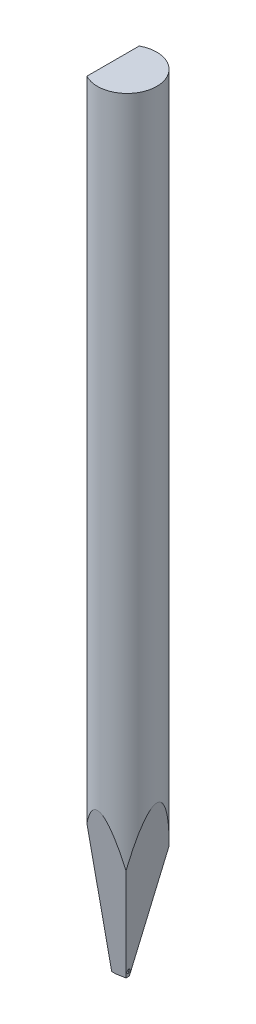
ISO-10303-21;
HEADER;
FILE_DESCRIPTION(('STEP AP214'),'2;1');
FILE_NAME('part.step','',(''),(''),'','','');
FILE_SCHEMA(('AUTOMOTIVE_DESIGN { 1 0 10303 214 1 1 1 1 }'));
ENDSEC;
DATA;
#1=APPLICATION_CONTEXT('core data for automotive mechanical design processes');
#2=APPLICATION_PROTOCOL_DEFINITION('international standard','automotive_design',2000,#1);
#3=PRODUCT_CONTEXT('',#1,'mechanical');
#4=PRODUCT('Part','Part','',(#3));
#5=PRODUCT_RELATED_PRODUCT_CATEGORY('part','',(#4));
#6=PRODUCT_DEFINITION_FORMATION('','',#4);
#7=PRODUCT_DEFINITION_CONTEXT('part definition',#1,'design');
#8=PRODUCT_DEFINITION('design','',#6,#7);
#9=PRODUCT_DEFINITION_SHAPE('','',#8);
#10=(LENGTH_UNIT() NAMED_UNIT(*) SI_UNIT(.MILLI.,.METRE.));
#11=(NAMED_UNIT(*) PLANE_ANGLE_UNIT() SI_UNIT($,.RADIAN.));
#12=(NAMED_UNIT(*) SI_UNIT($,.STERADIAN.) SOLID_ANGLE_UNIT());
#13=UNCERTAINTY_MEASURE_WITH_UNIT(LENGTH_MEASURE(1.E-05),#10,'distance_accuracy_value','');
#14=(GEOMETRIC_REPRESENTATION_CONTEXT(3) GLOBAL_UNCERTAINTY_ASSIGNED_CONTEXT((#13)) GLOBAL_UNIT_ASSIGNED_CONTEXT((#10,
#11,#12)) REPRESENTATION_CONTEXT('',''));
#15=CARTESIAN_POINT('',(0.,0.,0.));
#16=DIRECTION('',(0.,0.,1.));
#17=DIRECTION('',(1.,0.,0.));
#18=AXIS2_PLACEMENT_3D('',#15,#16,#17);
#19=CARTESIAN_POINT('',(-0.2794,0.,27.2760283406468));
#20=DIRECTION('',(-0.173648177666931,0.984807753012208,0.));
#21=DIRECTION('',(-0.984807753012208,-0.173648177666931,0.));
#22=AXIS2_PLACEMENT_3D('',#19,#20,#21);
#23=PLANE('',#22);
#24=DIRECTION('',(-0.984807753012208,-0.173648177666931,0.));
#25=VECTOR('',#24,1.);
#26=CARTESIAN_POINT('',(-0.2794,0.,0.0285749999999994));
#27=LINE('',#26,#25);
#28=CARTESIAN_POINT('',(-0.1143,0.0291115845149677,0.0285749999999997));
#29=VERTEX_POINT('',#28);
#30=CARTESIAN_POINT('',(-0.264607206717196,0.00260836857580255,0.028575));
#31=VERTEX_POINT('',#30);
#32=EDGE_CURVE('E178',#29,#31,#27,.T.);
#33=ORIENTED_EDGE('',*,*,#32,.F.);
#34=DIRECTION('',(0.,0.,1.));
#35=VECTOR('',#34,1.);
#36=CARTESIAN_POINT('',(-0.1143,0.0291115845149677,27.2760283406468));
#37=LINE('',#36,#35);
#38=CARTESIAN_POINT('',(-0.1143,0.0291115845149677,-0.0285749999999997));
#39=VERTEX_POINT('',#38);
#40=EDGE_CURVE('E223',#39,#29,#37,.T.);
#41=ORIENTED_EDGE('',*,*,#40,.F.);
#42=DIRECTION('',(-0.984807753012208,-0.173648177666931,0.));
#43=VECTOR('',#42,1.);
#44=CARTESIAN_POINT('',(-0.2794,0.,-0.0285749999999994));
#45=LINE('',#44,#43);
#46=CARTESIAN_POINT('',(-0.264607206717196,0.00260836857580255,-0.028575));
#47=VERTEX_POINT('',#46);
#48=EDGE_CURVE('E175',#39,#47,#45,.T.);
#49=ORIENTED_EDGE('',*,*,#48,.T.);
#50=CARTESIAN_POINT('',(-2.18806989639233,-0.33655,0.));
#51=DIRECTION('',(-0.173648177666931,0.984807753012208,0.));
#52=DIRECTION('',(-0.984807753012208,-0.173648177666931,0.));
#53=AXIS2_PLACEMENT_3D('',#50,#51,#52);
#54=ELLIPSE('',#53,1.96005512164276,0.34036);
#55=CARTESIAN_POINT('',(-0.26855815649043,0.00191170953135495,-0.0358970859696553));
#56=VERTEX_POINT('',#55);
#57=EDGE_CURVE('E76',#47,#56,#54,.T.);
#58=ORIENTED_EDGE('',*,*,#57,.T.);
#59=DIRECTION('',(0.984346441568213,0.173566836012845,-0.0306045161452665));
#60=VECTOR('',#59,1.);
#61=CARTESIAN_POINT('',(26.0304347628768,4.6391337266767,-0.853564443127717));
#62=LINE('',#61,#60);
#63=CARTESIAN_POINT('',(0.0142086463569767,0.0517711261220242,-0.0446886463569738));
#64=VERTEX_POINT('',#63);
#65=EDGE_CURVE('E213',#56,#64,#62,.T.);
#66=ORIENTED_EDGE('',*,*,#65,.T.);
#67=DIRECTION('',(0.,0.,-1.));
#68=VECTOR('',#67,1.);
#69=CARTESIAN_POINT('',(0.0142086463569737,0.0517711261220249,27.2760283406468));
#70=LINE('',#69,#68);
#71=CARTESIAN_POINT('',(0.0142086463569767,0.0517711261220242,0.0446886463569738));
#72=VERTEX_POINT('',#71);
#73=EDGE_CURVE('E181',#72,#64,#70,.T.);
#74=ORIENTED_EDGE('',*,*,#73,.F.);
#75=DIRECTION('',(-0.984346441568213,-0.173566836012845,-0.0306045161452665));
#76=VECTOR('',#75,1.);
#77=CARTESIAN_POINT('',(26.0304347628768,4.6391337266767,0.853564443127717));
#78=LINE('',#77,#76);
#79=CARTESIAN_POINT('',(-0.26855815649043,0.00191170953135495,0.0358970859696553));
#80=VERTEX_POINT('',#79);
#81=EDGE_CURVE('E191',#72,#80,#78,.T.);
#82=ORIENTED_EDGE('',*,*,#81,.T.);
#83=EDGE_CURVE('E216',#80,#31,#54,.T.);
#84=ORIENTED_EDGE('',*,*,#83,.T.);
#85=EDGE_LOOP('',(#33,#41,#49,#58,#66,#74,#82,#84));
#86=FACE_BOUND('',#85,.T.);
#87=ADVANCED_FACE('F46',(#86),#23,.F.);
#88=CARTESIAN_POINT('',(26.7532219491216,-0.33655,0.));
#89=DIRECTION('',(-1.,0.,0.));
#90=DIRECTION('',(0.,0.,1.));
#91=AXIS2_PLACEMENT_3D('',#88,#89,#90);
#92=CYLINDRICAL_SURFACE('',#91,0.34036);
#93=DIRECTION('',(-1.,0.,0.));
#94=VECTOR('',#93,1.);
#95=CARTESIAN_POINT('',(26.7532219491216,0.00191170953135473,0.0358970859696554));
#96=LINE('',#95,#94);
#97=CARTESIAN_POINT('',(-0.375919999999998,0.00191170953135473,0.0358970859696554));
#98=VERTEX_POINT('',#97);
#99=EDGE_CURVE('E185',#80,#98,#96,.T.);
#100=ORIENTED_EDGE('',*,*,#99,.T.);
#101=CARTESIAN_POINT('',(-0.37592,0.00191170953135473,-0.0358970859696554));
#102=CARTESIAN_POINT('',(-0.365756971335597,0.00317578781335809,-0.0239785113903732));
#103=CARTESIAN_POINT('',(-0.355599999999994,0.00380999999999997,-0.0119879732544419));
#104=CARTESIAN_POINT('',(-0.355599999999994,0.00380999999999995,0.0119879732544424));
#105=CARTESIAN_POINT('',(-0.365756971335597,0.00317578781335811,0.0239785113903729));
#106=CARTESIAN_POINT('',(-0.37592,0.00191170953135473,0.0358970859696553));
#107=(BOUNDED_CURVE() B_SPLINE_CURVE(3,(#101,#102,#103,#104,#105,#106),.UNSPECIFIED.,.F.,
.F.) B_SPLINE_CURVE_WITH_KNOTS((4,2,4),(1.46513182008187,1.5707963267949,1.67646083350792),
.UNSPECIFIED.) CURVE() GEOMETRIC_REPRESENTATION_ITEM() RATIONAL_B_SPLINE_CURVE((1.,1.,1.,1.,1.,1.)) REPRESENTATION_ITEM(''));
#108=CARTESIAN_POINT('',(-0.375919999999998,0.00191170953135473,-0.0358970859696554));
#109=VERTEX_POINT('',#108);
#110=EDGE_CURVE('E60',#98,#109,#107,.F.);
#111=ORIENTED_EDGE('',*,*,#110,.T.);
#112=DIRECTION('',(-1.,0.,0.));
#113=VECTOR('',#112,1.);
#114=CARTESIAN_POINT('',(26.7532219491216,0.00191170953135473,-0.0358970859696554));
#115=LINE('',#114,#113);
#116=EDGE_CURVE('E222',#109,#56,#115,.F.);
#117=ORIENTED_EDGE('',*,*,#116,.T.);
#118=ORIENTED_EDGE('',*,*,#57,.F.);
#119=DIRECTION('',(-1.,0.,0.));
#120=VECTOR('',#119,1.);
#121=CARTESIAN_POINT('',(26.7532219491216,0.00260836857580255,-0.028575));
#122=LINE('',#121,#120);
#123=CARTESIAN_POINT('',(-0.270298489816422,0.00260836857580467,-0.028575));
#124=VERTEX_POINT('',#123);
#125=EDGE_CURVE('E219',#47,#124,#122,.T.);
#126=ORIENTED_EDGE('',*,*,#125,.T.);
#127=CARTESIAN_POINT('',(-0.270298489816426,0.00260836857580259,0.028575));
#128=CARTESIAN_POINT('',(-0.278359100214701,0.00221626932534202,0.0332288492425529));
#129=CARTESIAN_POINT('',(-0.289281797844337,0.00224694405598525,0.0330338546009613));
#130=CARTESIAN_POINT('',(-0.307596392575123,0.003130563846706,0.0221747468136145));
#131=CARTESIAN_POINT('',(-0.314368855863126,0.00381431132404112,0.0112699230252015));
#132=CARTESIAN_POINT('',(-0.314294835670741,0.00380563943309772,-0.0115288461768703));
#133=CARTESIAN_POINT('',(-0.3074835861126,0.0031190469839627,-0.0223381582503309));
#134=CARTESIAN_POINT('',(-0.289156503578033,0.00224008059703033,-0.0330958620083312));
#135=CARTESIAN_POINT('',(-0.278322558634203,0.00221755981884593,-0.0332135322986704));
#136=CARTESIAN_POINT('',(-0.270298489816426,0.0026083685758026,-0.028575));
#137=(BOUNDED_CURVE() B_SPLINE_CURVE(3,(#127,#128,#129,#130,#131,#132,#133,#134,#135,#136),
.UNSPECIFIED.,.F.,.F.) B_SPLINE_CURVE_WITH_KNOTS((4,2,2,2,4),(0.,2.38139585135698E-05,
4.76279170271358E-05,7.14418755407019E-05,9.5255834054268E-05),
.UNSPECIFIED.) CURVE() GEOMETRIC_REPRESENTATION_ITEM() RATIONAL_B_SPLINE_CURVE((1.,1.,1.,1.,1.,
1.,1.,1.,1.,1.)) REPRESENTATION_ITEM(''));
#138=CARTESIAN_POINT('',(-0.270298489816422,0.0026083685758042,0.028575));
#139=VERTEX_POINT('',#138);
#140=EDGE_CURVE('E225',#124,#139,#137,.F.);
#141=ORIENTED_EDGE('',*,*,#140,.T.);
#142=DIRECTION('',(-1.,0.,0.));
#143=VECTOR('',#142,1.);
#144=CARTESIAN_POINT('',(26.7532219491216,0.00260836857580255,0.028575));
#145=LINE('',#144,#143);
#146=EDGE_CURVE('E226',#31,#139,#145,.T.);
#147=ORIENTED_EDGE('',*,*,#146,.F.);
#148=ORIENTED_EDGE('',*,*,#83,.F.);
#149=EDGE_LOOP('',(#100,#111,#117,#118,#126,#141,#147,#148));
#150=FACE_BOUND('',#149,.T.);
#151=ADVANCED_FACE('F239',(#150),#92,.F.);
#152=CARTESIAN_POINT('',(0.,21.0312,0.));
#153=DIRECTION('',(0.,-1.,0.));
#154=DIRECTION('',(0.,0.,-1.));
#155=AXIS2_PLACEMENT_3D('',#152,#153,#154);
#156=CYLINDRICAL_SURFACE('',#155,0.792479999999998);
#157=CARTESIAN_POINT('',(0.,-0.201670781505604,0.));
#158=DIRECTION('',(0.,-0.173648177666931,0.984807753012208));
#159=DIRECTION('',(0.,-0.984807753012208,-0.173648177666931));
#160=AXIS2_PLACEMENT_3D('',#157,#158,#159);
#161=ELLIPSE('',#160,4.56371043248163,0.792479999999998);
#162=CARTESIAN_POINT('',(0.544920706940428,3.06158878676079,0.575400706940426));
#163=VERTEX_POINT('',#162);
#164=CARTESIAN_POINT('',(-0.37592,3.75487126564512,0.69764511322018));
#165=VERTEX_POINT('',#164);
#166=EDGE_CURVE('E194',#163,#165,#161,.T.);
#167=ORIENTED_EDGE('',*,*,#166,.F.);
#168=CARTESIAN_POINT('',(0.,-0.0288101116436568,0.));
#169=DIRECTION('',(-0.984807753012208,0.173648177666931,0.));
#170=DIRECTION('',(-0.173648177666931,-0.984807753012208,0.));
#171=AXIS2_PLACEMENT_3D('',#168,#169,#170);
#172=ELLIPSE('',#171,4.56371043248164,0.792479999999998);
#173=CARTESIAN_POINT('',(0.544920706940428,3.06158878676079,-0.575400706940426));
#174=VERTEX_POINT('',#173);
#175=EDGE_CURVE('E184',#163,#174,#172,.T.);
#176=ORIENTED_EDGE('',*,*,#175,.T.);
#177=CARTESIAN_POINT('',(0.,-0.201670781505604,0.));
#178=DIRECTION('',(0.,-0.173648177666931,-0.984807753012208));
#179=DIRECTION('',(0.,-0.984807753012208,0.173648177666931));
#180=AXIS2_PLACEMENT_3D('',#177,#178,#179);
#181=ELLIPSE('',#180,4.56371043248163,0.792479999999998);
#182=CARTESIAN_POINT('',(-0.37592,3.75487126564511,-0.69764511322018));
#183=VERTEX_POINT('',#182);
#184=EDGE_CURVE('E197',#183,#174,#181,.T.);
#185=ORIENTED_EDGE('',*,*,#184,.F.);
#186=DIRECTION('',(0.,-1.,0.));
#187=VECTOR('',#186,1.);
#188=CARTESIAN_POINT('',(-0.37592,21.0312,-0.69764511322018));
#189=LINE('',#188,#187);
#190=CARTESIAN_POINT('',(-0.37592,21.0312,-0.69764511322018));
#191=VERTEX_POINT('',#190);
#192=EDGE_CURVE('E203',#191,#183,#189,.T.);
#193=ORIENTED_EDGE('',*,*,#192,.F.);
#194=CARTESIAN_POINT('',(0.,21.0312,0.));
#195=DIRECTION('',(0.,1.,0.));
#196=DIRECTION('',(0.,0.,1.));
#197=AXIS2_PLACEMENT_3D('',#194,#195,#196);
#198=CIRCLE('',#197,0.792479999999998);
#199=CARTESIAN_POINT('',(-0.37592,21.0312,0.69764511322018));
#200=VERTEX_POINT('',#199);
#201=EDGE_CURVE('E206',#200,#191,#198,.T.);
#202=ORIENTED_EDGE('',*,*,#201,.F.);
#203=DIRECTION('',(0.,-1.,0.));
#204=VECTOR('',#203,1.);
#205=CARTESIAN_POINT('',(-0.37592,21.0312,0.69764511322018));
#206=LINE('',#205,#204);
#207=EDGE_CURVE('E201',#165,#200,#206,.F.);
#208=ORIENTED_EDGE('',*,*,#207,.F.);
#209=EDGE_LOOP('',(#167,#176,#185,#193,#202,#208));
#210=FACE_BOUND('',#209,.T.);
#211=ADVANCED_FACE('F249',(#210),#156,.T.);
#212=CARTESIAN_POINT('',(-0.37592,21.0312,-0.80247998));
#213=DIRECTION('',(-1.,0.,0.));
#214=DIRECTION('',(0.,0.,1.));
#215=AXIS2_PLACEMENT_3D('',#212,#213,#214);
#216=PLANE('',#215);
#217=DIRECTION('',(0.,-0.984807753012208,0.173648177666931));
#218=VECTOR('',#217,1.);
#219=CARTESIAN_POINT('',(-0.37592,20.5281827638758,-3.65523248618578));
#220=LINE('',#219,#218);
#221=EDGE_CURVE('E214',#183,#109,#220,.T.);
#222=ORIENTED_EDGE('',*,*,#221,.T.);
#223=CARTESIAN_POINT('',(-0.37592,0.00191170953135473,0.0358970859696553));
#224=CARTESIAN_POINT('',(-0.37592,0.0132160709452302,0.0251134563945906));
#225=CARTESIAN_POINT('',(-0.37592,0.0241300000000007,0.0127028508263933));
#226=CARTESIAN_POINT('',(-0.37592,0.0241300000000007,-0.0127028508263929));
#227=CARTESIAN_POINT('',(-0.37592,0.0132160709452305,-0.0251134563945911));
#228=CARTESIAN_POINT('',(-0.37592,0.00191170953135473,-0.0358970859696554));
#229=(BOUNDED_CURVE() B_SPLINE_CURVE(3,(#223,#224,#225,#226,#227,#228),.UNSPECIFIED.,.F.,
.F.) B_SPLINE_CURVE_WITH_KNOTS((4,2,4),(1.46513182008187,1.5707963267949,1.67646083350792),
.UNSPECIFIED.) CURVE() GEOMETRIC_REPRESENTATION_ITEM() RATIONAL_B_SPLINE_CURVE((1.,1.,1.,1.,1.,1.)) REPRESENTATION_ITEM(''));
#230=EDGE_CURVE('E12',#109,#98,#229,.F.);
#231=ORIENTED_EDGE('',*,*,#230,.T.);
#232=DIRECTION('',(0.,0.984807753012208,0.173648177666931));
#233=VECTOR('',#232,1.);
#234=CARTESIAN_POINT('',(-0.37592,20.2537184461002,3.60683702172021));
#235=LINE('',#234,#233);
#236=EDGE_CURVE('E209',#98,#165,#235,.T.);
#237=ORIENTED_EDGE('',*,*,#236,.T.);
#238=ORIENTED_EDGE('',*,*,#207,.T.);
#239=DIRECTION('',(0.,0.,-1.));
#240=VECTOR('',#239,1.);
#241=CARTESIAN_POINT('',(-0.37592,21.0312,-0.80247998));
#242=LINE('',#241,#240);
#243=EDGE_CURVE('E199',#200,#191,#242,.T.);
#244=ORIENTED_EDGE('',*,*,#243,.T.);
#245=ORIENTED_EDGE('',*,*,#192,.T.);
#246=EDGE_LOOP('',(#222,#231,#237,#238,#244,#245));
#247=FACE_BOUND('',#246,.T.);
#248=ADVANCED_FACE('F291',(#247),#216,.T.);
#249=CARTESIAN_POINT('',(0.,21.0312,0.));
#250=DIRECTION('',(0.,1.,0.));
#251=DIRECTION('',(0.,0.,1.));
#252=AXIS2_PLACEMENT_3D('',#249,#250,#251);
#253=PLANE('',#252);
#254=ORIENTED_EDGE('',*,*,#201,.T.);
#255=ORIENTED_EDGE('',*,*,#243,.F.);
#256=EDGE_LOOP('',(#254,#255));
#257=FACE_BOUND('',#256,.T.);
#258=ADVANCED_FACE('F301',(#257),#253,.T.);
#259=CARTESIAN_POINT('',(26.8738719491216,0.,0.03556));
#260=DIRECTION('',(0.,-0.173648177666931,0.984807753012208));
#261=DIRECTION('',(0.,-0.984807753012208,-0.173648177666931));
#262=AXIS2_PLACEMENT_3D('',#259,#260,#261);
#263=PLANE('',#262);
#264=ORIENTED_EDGE('',*,*,#99,.F.);
#265=ORIENTED_EDGE('',*,*,#81,.F.);
#266=DIRECTION('',(-0.171087869746036,-0.970287525247814,-0.171087869746036));
#267=VECTOR('',#266,1.);
#268=CARTESIAN_POINT('',(0.791557999082992,4.46033837772866,0.822037999082991));
#269=LINE('',#268,#267);
#270=EDGE_CURVE('E188',#163,#72,#269,.T.);
#271=ORIENTED_EDGE('',*,*,#270,.F.);
#272=ORIENTED_EDGE('',*,*,#166,.T.);
#273=ORIENTED_EDGE('',*,*,#236,.F.);
#274=EDGE_LOOP('',(#264,#265,#271,#272,#273));
#275=FACE_BOUND('',#274,.T.);
#276=ADVANCED_FACE('F306',(#275),#263,.T.);
#277=CARTESIAN_POINT('',(26.8738719491216,0.,-0.03556));
#278=DIRECTION('',(0.,-0.173648177666931,-0.984807753012208));
#279=DIRECTION('',(0.,0.984807753012208,-0.173648177666931));
#280=AXIS2_PLACEMENT_3D('',#277,#278,#279);
#281=PLANE('',#280);
#282=ORIENTED_EDGE('',*,*,#116,.F.);
#283=ORIENTED_EDGE('',*,*,#221,.F.);
#284=ORIENTED_EDGE('',*,*,#184,.T.);
#285=DIRECTION('',(0.171087869746036,0.970287525247814,-0.171087869746036));
#286=VECTOR('',#285,1.);
#287=CARTESIAN_POINT('',(0.791557999082992,4.46033837772866,-0.822037999082991));
#288=LINE('',#287,#286);
#289=EDGE_CURVE('E210',#64,#174,#288,.T.);
#290=ORIENTED_EDGE('',*,*,#289,.F.);
#291=ORIENTED_EDGE('',*,*,#65,.F.);
#292=EDGE_LOOP('',(#282,#283,#284,#290,#291));
#293=FACE_BOUND('',#292,.T.);
#294=ADVANCED_FACE('F302',(#293),#281,.T.);
#295=CARTESIAN_POINT('',(0.0142086463569737,0.0517711261220249,27.2760283406468));
#296=DIRECTION('',(-0.984807753012208,0.173648177666931,0.));
#297=DIRECTION('',(-0.173648177666931,-0.984807753012208,0.));
#298=AXIS2_PLACEMENT_3D('',#295,#296,#297);
#299=PLANE('',#298);
#300=CARTESIAN_POINT('',(0.0404794326272254,0.200760158683566,0.));
#301=DIRECTION('',(-0.984807753012208,0.173648177666931,0.));
#302=DIRECTION('',(0.173648177666931,0.984807753012208,0.));
#303=AXIS2_PLACEMENT_3D('',#300,#301,#302);
#304=ELLIPSE('',#303,0.0566555398592854,0.0406948626453099);
#305=CARTESIAN_POINT('',(0.0503175638785265,0.256554973588082,0.));
#306=VERTEX_POINT('',#305);
#307=EDGE_CURVE('E180',#306,#306,#304,.F.);
#308=ORIENTED_EDGE('',*,*,#307,.F.);
#309=EDGE_LOOP('',(#308));
#310=FACE_BOUND('',#309,.T.);
#311=ORIENTED_EDGE('',*,*,#175,.F.);
#312=ORIENTED_EDGE('',*,*,#270,.T.);
#313=ORIENTED_EDGE('',*,*,#73,.T.);
#314=ORIENTED_EDGE('',*,*,#289,.T.);
#315=EDGE_LOOP('',(#311,#312,#313,#314));
#316=FACE_BOUND('',#315,.T.);
#317=ADVANCED_FACE('F254',(#310,#316),#299,.F.);
#318=CARTESIAN_POINT('',(-0.1143,0.0939800000000001,0.028575));
#319=DIRECTION('',(-1.,0.,0.));
#320=DIRECTION('',(0.,0.,1.));
#321=AXIS2_PLACEMENT_3D('',#318,#319,#320);
#322=PLANE('',#321);
#323=ORIENTED_EDGE('',*,*,#40,.T.);
#324=DIRECTION('',(0.,1.,0.));
#325=VECTOR('',#324,1.);
#326=CARTESIAN_POINT('',(-0.1143,0.0939800000000001,0.028575));
#327=LINE('',#326,#325);
#328=CARTESIAN_POINT('',(-0.1143,0.0939800000000001,0.028575));
#329=VERTEX_POINT('',#328);
#330=EDGE_CURVE('E164',#29,#329,#327,.T.);
#331=ORIENTED_EDGE('',*,*,#330,.T.);
#332=DIRECTION('',(0.,0.,-1.));
#333=VECTOR('',#332,1.);
#334=CARTESIAN_POINT('',(-0.1143,0.0939800000000001,0.028575));
#335=LINE('',#334,#333);
#336=CARTESIAN_POINT('',(-0.1143,0.0939800000000001,0.0254));
#337=VERTEX_POINT('',#336);
#338=EDGE_CURVE('E151',#329,#337,#335,.T.);
#339=ORIENTED_EDGE('',*,*,#338,.T.);
#340=CARTESIAN_POINT('',(-0.1143,0.0939800000000001,0.));
#341=DIRECTION('',(1.,0.,0.));
#342=DIRECTION('',(0.,1.,0.));
#343=AXIS2_PLACEMENT_3D('',#340,#341,#342);
#344=ELLIPSE('',#343,0.0293293936748329,0.0254);
#345=CARTESIAN_POINT('',(-0.1143,0.0939800000000001,-0.0253999999999983));
#346=VERTEX_POINT('',#345);
#347=EDGE_CURVE('E143',#346,#337,#344,.F.);
#348=ORIENTED_EDGE('',*,*,#347,.F.);
#349=CARTESIAN_POINT('',(-0.1143,0.0939800000000001,-0.028575));
#350=VERTEX_POINT('',#349);
#351=EDGE_CURVE('E148',#346,#350,#335,.T.);
#352=ORIENTED_EDGE('',*,*,#351,.T.);
#353=DIRECTION('',(0.,1.,0.));
#354=VECTOR('',#353,1.);
#355=CARTESIAN_POINT('',(-0.1143,0.0939800000000001,-0.028575));
#356=LINE('',#355,#354);
#357=EDGE_CURVE('E171',#39,#350,#356,.T.);
#358=ORIENTED_EDGE('',*,*,#357,.F.);
#359=EDGE_LOOP('',(#323,#331,#339,#348,#352,#358));
#360=FACE_BOUND('',#359,.T.);
#361=ADVANCED_FACE('F145',(#360),#322,.T.);
#362=CARTESIAN_POINT('',(0.010386491532256,0.165967779450457,0.));
#363=DIRECTION('',(0.866025403784441,0.499999999999995,0.));
#364=DIRECTION('',(-0.499999999999995,0.866025403784441,0.));
#365=AXIS2_PLACEMENT_3D('',#362,#363,#364);
#366=CONICAL_SURFACE('',#365,0.0254,0.392699081698725);
#367=CARTESIAN_POINT('',(0.010386491532256,0.165967779450457,0.));
#368=DIRECTION('',(0.866025403784441,0.499999999999995,0.));
#369=DIRECTION('',(-0.499999999999995,0.866025403784441,0.));
#370=AXIS2_PLACEMENT_3D('',#367,#368,#369);
#371=CIRCLE('',#370,0.0254);
#372=CARTESIAN_POINT('',(-0.00231350846774383,0.187964824706582,0.));
#373=VERTEX_POINT('',#372);
#374=EDGE_CURVE('E159',#373,#373,#371,.T.);
#375=ORIENTED_EDGE('',*,*,#374,.F.);
#376=EDGE_LOOP('',(#375));
#377=FACE_BOUND('',#376,.T.);
#378=ORIENTED_EDGE('',*,*,#307,.T.);
#379=EDGE_LOOP('',(#378));
#380=FACE_BOUND('',#379,.T.);
#381=ADVANCED_FACE('F453',(#377,#380),#366,.F.);
#382=CARTESIAN_POINT('',(-0.217545053817371,0.0939800000000001,0.));
#383=DIRECTION('',(-0.500000000000004,-0.866025403784436,0.));
#384=DIRECTION('',(0.866025403784436,-0.500000000000004,0.));
#385=AXIS2_PLACEMENT_3D('',#382,#383,#384);
#386=CYLINDRICAL_SURFACE('',#385,0.028575);
#387=DIRECTION('',(-0.500000000000004,-0.866025403784436,0.));
#388=VECTOR('',#387,1.);
#389=CARTESIAN_POINT('',(-0.203853324086859,0.117694771536749,0.028575));
#390=LINE('',#389,#388);
#391=CARTESIAN_POINT('',(-0.217545053817371,0.0939800000000001,0.028575));
#392=VERTEX_POINT('',#391);
#393=EDGE_CURVE('E166',#392,#139,#390,.T.);
#394=ORIENTED_EDGE('',*,*,#393,.T.);
#395=CARTESIAN_POINT('',(-0.270298489816426,0.0026083685758026,-0.028575));
#396=CARTESIAN_POINT('',(-0.278324965217675,0.00726516076957318,-0.0285750000000005));
#397=CARTESIAN_POINT('',(-0.284754069961338,0.00980772083814249,-0.0246677652429068));
#398=CARTESIAN_POINT('',(-0.294104706380072,0.0131325634305097,-0.0140922105999696));
#399=CARTESIAN_POINT('',(-0.29670988453043,0.0139726401064736,-0.00714153323061719));
#400=CARTESIAN_POINT('',(-0.296758673133644,0.0139673876968946,0.00698118055188452));
#401=CARTESIAN_POINT('',(-0.294182221783248,0.0131243082575392,0.0139838160543543));
#402=CARTESIAN_POINT('',(-0.284853297601772,0.00979968639561061,0.0246185446540713));
#403=CARTESIAN_POINT('',(-0.278357954934871,0.00727750260510806,0.0285750000000003));
#404=CARTESIAN_POINT('',(-0.270298489816426,0.00260836857580259,0.028575));
#405=(BOUNDED_CURVE() B_SPLINE_CURVE(3,(#395,#396,#397,#398,#399,#400,#401,#402,#403,#404),
.UNSPECIFIED.,.F.,.F.) B_SPLINE_CURVE_WITH_KNOTS((4,2,2,2,4),(0.,2.38139585135698E-05,
4.76279170271358E-05,7.14418755407019E-05,9.5255834054268E-05),
.UNSPECIFIED.) CURVE() GEOMETRIC_REPRESENTATION_ITEM() RATIONAL_B_SPLINE_CURVE((1.,1.,1.,1.,1.,
1.,1.,1.,1.,1.)) REPRESENTATION_ITEM(''));
#406=EDGE_CURVE('E67',#139,#124,#405,.F.);
#407=ORIENTED_EDGE('',*,*,#406,.T.);
#408=DIRECTION('',(0.500000000000004,0.866025403784436,0.));
#409=VECTOR('',#408,1.);
#410=CARTESIAN_POINT('',(-0.217545053817371,0.0939800000000001,-0.028575));
#411=LINE('',#410,#409);
#412=CARTESIAN_POINT('',(-0.217545053817371,0.0939800000000001,-0.028575));
#413=VERTEX_POINT('',#412);
#414=EDGE_CURVE('E176',#124,#413,#411,.T.);
#415=ORIENTED_EDGE('',*,*,#414,.T.);
#416=CARTESIAN_POINT('',(-0.217545053817371,0.0939800000000001,0.));
#417=DIRECTION('',(0.,-1.,0.));
#418=DIRECTION('',(-1.,0.,0.));
#419=AXIS2_PLACEMENT_3D('',#416,#417,#418);
#420=ELLIPSE('',#419,0.0329955678841872,0.028575);
#421=EDGE_CURVE('E173',#413,#392,#420,.F.);
#422=ORIENTED_EDGE('',*,*,#421,.T.);
#423=EDGE_LOOP('',(#394,#407,#415,#422));
#424=FACE_BOUND('',#423,.T.);
#425=ADVANCED_FACE('F251',(#424),#386,.F.);
#426=CARTESIAN_POINT('',(0.,0.,0.028575));
#427=DIRECTION('',(0.,0.,-1.));
#428=DIRECTION('',(-1.,0.,0.));
#429=AXIS2_PLACEMENT_3D('',#426,#427,#428);
#430=PLANE('',#429);
#431=ORIENTED_EDGE('',*,*,#32,.T.);
#432=ORIENTED_EDGE('',*,*,#146,.T.);
#433=ORIENTED_EDGE('',*,*,#393,.F.);
#434=DIRECTION('',(-1.,0.,0.));
#435=VECTOR('',#434,1.);
#436=CARTESIAN_POINT('',(-0.250540621701558,0.0939800000000001,0.028575));
#437=LINE('',#436,#435);
#438=EDGE_CURVE('E167',#329,#392,#437,.T.);
#439=ORIENTED_EDGE('',*,*,#438,.F.);
#440=ORIENTED_EDGE('',*,*,#330,.F.);
#441=EDGE_LOOP('',(#431,#432,#433,#439,#440));
#442=FACE_BOUND('',#441,.T.);
#443=ADVANCED_FACE('F466',(#442),#430,.T.);
#444=CARTESIAN_POINT('',(0.,0.,-0.028575));
#445=DIRECTION('',(0.,0.,-1.));
#446=DIRECTION('',(-1.,0.,0.));
#447=AXIS2_PLACEMENT_3D('',#444,#445,#446);
#448=PLANE('',#447);
#449=ORIENTED_EDGE('',*,*,#357,.T.);
#450=DIRECTION('',(-1.,0.,0.));
#451=VECTOR('',#450,1.);
#452=CARTESIAN_POINT('',(-0.250540621701558,0.0939800000000001,-0.028575));
#453=LINE('',#452,#451);
#454=EDGE_CURVE('E153',#350,#413,#453,.T.);
#455=ORIENTED_EDGE('',*,*,#454,.T.);
#456=ORIENTED_EDGE('',*,*,#414,.F.);
#457=ORIENTED_EDGE('',*,*,#125,.F.);
#458=ORIENTED_EDGE('',*,*,#48,.F.);
#459=EDGE_LOOP('',(#449,#455,#456,#457,#458));
#460=FACE_BOUND('',#459,.T.);
#461=ADVANCED_FACE('F471',(#460),#448,.F.);
#462=CARTESIAN_POINT('',(-0.250540621701558,0.0939800000000001,0.028575));
#463=DIRECTION('',(0.,-1.,0.));
#464=DIRECTION('',(0.,0.,-1.));
#465=AXIS2_PLACEMENT_3D('',#462,#463,#464);
#466=PLANE('',#465);
#467=ORIENTED_EDGE('',*,*,#454,.F.);
#468=ORIENTED_EDGE('',*,*,#351,.F.);
#469=CARTESIAN_POINT('',(-0.1143,0.0939800000000001,0.));
#470=DIRECTION('',(0.,1.,0.));
#471=DIRECTION('',(1.,0.,0.));
#472=AXIS2_PLACEMENT_3D('',#469,#470,#471);
#473=ELLIPSE('',#472,0.0508000000000004,0.0254);
#474=EDGE_CURVE('E154',#337,#346,#473,.F.);
#475=ORIENTED_EDGE('',*,*,#474,.F.);
#476=ORIENTED_EDGE('',*,*,#338,.F.);
#477=ORIENTED_EDGE('',*,*,#438,.T.);
#478=ORIENTED_EDGE('',*,*,#421,.F.);
#479=EDGE_LOOP('',(#467,#468,#475,#476,#477,#478));
#480=FACE_BOUND('',#479,.T.);
#481=ADVANCED_FACE('F161',(#480),#466,.T.);
#482=CARTESIAN_POINT('',(-0.370403694095365,-0.0538815367264147,0.));
#483=DIRECTION('',(0.866025403784441,0.499999999999995,0.));
#484=DIRECTION('',(-0.499999999999995,0.866025403784441,0.));
#485=AXIS2_PLACEMENT_3D('',#482,#483,#484);
#486=CYLINDRICAL_SURFACE('',#485,0.0254);
#487=ORIENTED_EDGE('',*,*,#347,.T.);
#488=ORIENTED_EDGE('',*,*,#474,.T.);
#489=EDGE_LOOP('',(#487,#488));
#490=FACE_BOUND('',#489,.T.);
#491=ORIENTED_EDGE('',*,*,#374,.T.);
#492=EDGE_LOOP('',(#491));
#493=FACE_BOUND('',#492,.T.);
#494=ADVANCED_FACE('F156',(#490,#493),#486,.F.);
#495=CARTESIAN_POINT('',(-0.270298489816426,0.0026083685758026,-0.028575));
#496=CARTESIAN_POINT('',(-0.278322558634203,0.00221755981884593,-0.0332135322986704));
#497=CARTESIAN_POINT('',(-0.289156503578033,0.00224008059703033,-0.0330958620083312));
#498=CARTESIAN_POINT('',(-0.3074835861126,0.0031190469839627,-0.0223381582503309));
#499=CARTESIAN_POINT('',(-0.314294835670741,0.00380563943309772,-0.0115288461768703));
#500=CARTESIAN_POINT('',(-0.314368855863126,0.00381431132404112,0.0112699230252015));
#501=CARTESIAN_POINT('',(-0.307596392575123,0.003130563846706,0.0221747468136145));
#502=CARTESIAN_POINT('',(-0.289281797844337,0.00224694405598525,0.0330338546009613));
#503=CARTESIAN_POINT('',(-0.278359100214701,0.00221626932534202,0.0332288492425529));
#504=CARTESIAN_POINT('',(-0.270298489816426,0.00260836857580259,0.028575));
#505=CARTESIAN_POINT('',(-0.270298489816426,0.0026083685758026,-0.028575));
#506=CARTESIAN_POINT('',(-0.277556962758148,0.00260876055560271,-0.0285741662095632));
#507=CARTESIAN_POINT('',(-0.285661929050097,0.00287957069673338,-0.0265346542955287));
#508=CARTESIAN_POINT('',(-0.298204887738006,0.00350059584722069,-0.0164549899921406));
#509=CARTESIAN_POINT('',(-0.302570052831374,0.00380799896316075,-0.0083748538469708));
#510=CARTESIAN_POINT('',(-0.3026301981049,0.00381197852691793,0.00818587207914406));
#511=CARTESIAN_POINT('',(-0.298298778864614,0.00350612718148912,0.0163355095917602));
#512=CARTESIAN_POINT('',(-0.285771776178691,0.00288331781779368,0.0264894153475509));
#513=CARTESIAN_POINT('',(-0.277588305336967,0.00260871264191672,0.0285747525397311));
#514=CARTESIAN_POINT('',(-0.270298489816426,0.00260836857580259,0.028575));
#515=CARTESIAN_POINT('',(-0.270298489816426,0.0026083685758026,-0.028575));
#516=CARTESIAN_POINT('',(-0.278324965217675,0.00726516076957318,-0.0285750000000005));
#517=CARTESIAN_POINT('',(-0.284754069961338,0.00980772083814249,-0.0246677652429068));
#518=CARTESIAN_POINT('',(-0.294104706380072,0.0131325634305097,-0.0140922105999696));
#519=CARTESIAN_POINT('',(-0.29670988453043,0.0139726401064736,-0.00714153323061719));
#520=CARTESIAN_POINT('',(-0.296758673133644,0.0139673876968946,0.00698118055188452));
#521=CARTESIAN_POINT('',(-0.294182221783248,0.0131243082575392,0.0139838160543543));
#522=CARTESIAN_POINT('',(-0.284853297601772,0.00979968639561061,0.0246185446540713));
#523=CARTESIAN_POINT('',(-0.278357954934871,0.00727750260510806,0.0285750000000003));
#524=CARTESIAN_POINT('',(-0.270298489816426,0.00260836857580259,0.028575));
#525=(BOUNDED_SURFACE() B_SPLINE_SURFACE(2,3,((#495,#496,#497,#498,#499,#500,#501,#502,#503,
#504),(#505,#506,#507,#508,#509,#510,#511,#512,#513,#514),(#515,#516,#517,#518,#519,#520,#521,
#522,#523,#524)),.UNSPECIFIED.,.F.,.F.,.F.) B_SPLINE_SURFACE_WITH_KNOTS((3,3),(4,2,2,2,4),(0.,
1.),(0.,2.38139585135698E-05,4.76279170271358E-05,7.14418755407019E-05,9.5255834054268E-05),
.UNSPECIFIED.) GEOMETRIC_REPRESENTATION_ITEM() RATIONAL_B_SPLINE_SURFACE(((1.,1.,1.,1.,1.,1.,1.,
1.,1.,1.),(0.736191287601453,0.795437788404464,0.825303848195498,0.860781274302795,
0.865976760447467,0.866073506091855,0.860951495617543,0.825623070257652,0.795671165272323,
0.736191287601457),(1.,1.,1.,1.,1.,1.,1.,1.,1.,1.))) REPRESENTATION_ITEM('') SURFACE());
#526=ORIENTED_EDGE('',*,*,#140,.F.);
#527=ORIENTED_EDGE('',*,*,#406,.F.);
#528=EDGE_LOOP('',(#526,#527));
#529=FACE_BOUND('',#528,.T.);
#530=ADVANCED_FACE('F311',(#529),#525,.T.);
#531=CARTESIAN_POINT('',(-0.37592,0.00191170953135473,0.0358970859696553));
#532=CARTESIAN_POINT('',(-0.365756971335597,0.00317578781335811,0.0239785113903729));
#533=CARTESIAN_POINT('',(-0.355599999999994,0.00380999999999995,0.0119879732544424));
#534=CARTESIAN_POINT('',(-0.355599999999994,0.00380999999999997,-0.0119879732544419));
#535=CARTESIAN_POINT('',(-0.365756971335597,0.00317578781335809,-0.0239785113903732));
#536=CARTESIAN_POINT('',(-0.37592,0.00191170953135473,-0.0358970859696554));
#537=CARTESIAN_POINT('',(-0.37592,0.00191170953135473,0.0358970859696553));
#538=CARTESIAN_POINT('',(-0.375919999999975,0.00317605859568918,0.0239759575520179));
#539=CARTESIAN_POINT('',(-0.37592,0.00380999999999434,0.0119879732544421));
#540=CARTESIAN_POINT('',(-0.375920000000001,0.00380999999999398,-0.0119879732544417));
#541=CARTESIAN_POINT('',(-0.375919999999976,0.00317605859568852,-0.0239759575520179));
#542=CARTESIAN_POINT('',(-0.37592,0.00191170953135473,-0.0358970859696554));
#543=CARTESIAN_POINT('',(-0.37592,0.00191170953135473,0.0358970859696553));
#544=CARTESIAN_POINT('',(-0.37592,0.0132160709452302,0.0251134563945906));
#545=CARTESIAN_POINT('',(-0.37592,0.0241300000000007,0.0127028508263933));
#546=CARTESIAN_POINT('',(-0.37592,0.0241300000000007,-0.0127028508263929));
#547=CARTESIAN_POINT('',(-0.37592,0.0132160709452305,-0.0251134563945911));
#548=CARTESIAN_POINT('',(-0.37592,0.00191170953135473,-0.0358970859696554));
#549=(BOUNDED_SURFACE() B_SPLINE_SURFACE(2,3,((#531,#532,#533,#534,#535,#536),(#537,#538,#539,
#540,#541,#542),(#543,#544,#545,#546,#547,#548)),.UNSPECIFIED.,.F.,.F.,
.F.) B_SPLINE_SURFACE_WITH_KNOTS((3,3),(4,2,4),(0.,1.),(1.46513182008187,1.5707963267949,
1.67646083350792),.UNSPECIFIED.) GEOMETRIC_REPRESENTATION_ITEM() RATIONAL_B_SPLINE_SURFACE(((1.,
1.,1.,1.,1.,1.),(0.70710678118654,0.70710678118654,0.707106781186434,0.707106781186434,
0.70710678118654,0.70710678118654),(1.,1.,1.,1.,1.,1.))) REPRESENTATION_ITEM('') SURFACE());
#550=ORIENTED_EDGE('',*,*,#110,.F.);
#551=ORIENTED_EDGE('',*,*,#230,.F.);
#552=EDGE_LOOP('',(#550,#551));
#553=FACE_BOUND('',#552,.T.);
#554=ADVANCED_FACE('F49',(#553),#549,.T.);
#555=CLOSED_SHELL('',(#87,#151,#211,#248,#258,#276,#294,#317,#361,#381,#425,#443,#461,#481,#494,
#530,#554));
#556=MANIFOLD_SOLID_BREP('B2',#555);
#557=ADVANCED_BREP_SHAPE_REPRESENTATION('',(#18,#556),#14);
#558=SHAPE_DEFINITION_REPRESENTATION(#9,#557);
ENDSEC;
END-ISO-10303-21;
